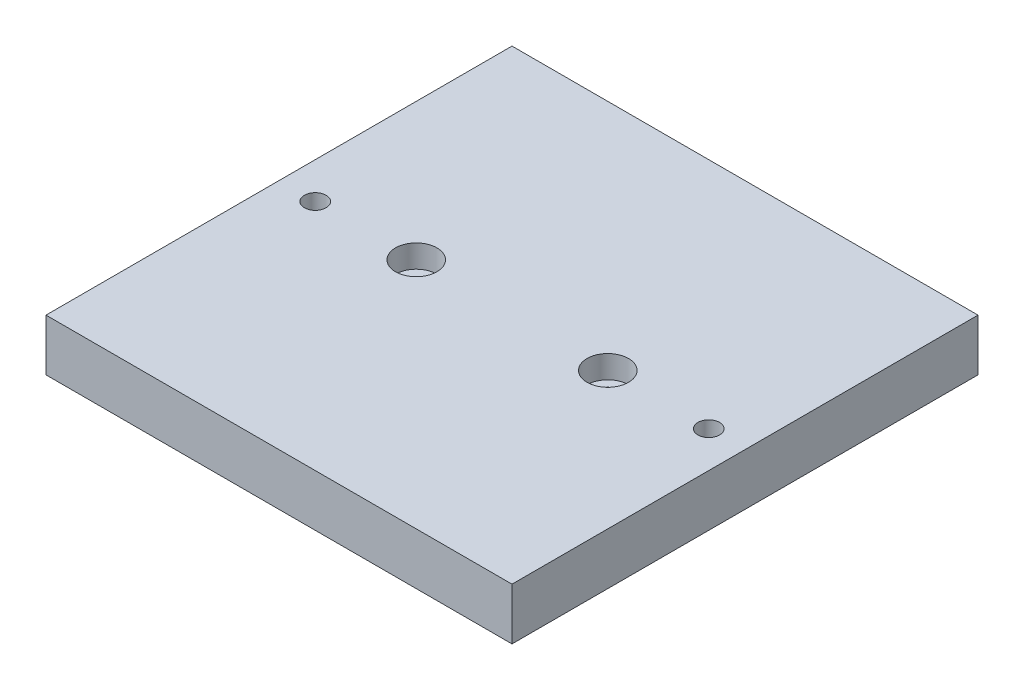
ISO-10303-21;
HEADER;
FILE_DESCRIPTION(('STEP AP214'),'2;1');
FILE_NAME('part.step','',(''),(''),'','','');
FILE_SCHEMA(('AUTOMOTIVE_DESIGN { 1 0 10303 214 1 1 1 1 }'));
ENDSEC;
DATA;
#1=APPLICATION_CONTEXT('core data for automotive mechanical design processes');
#2=APPLICATION_PROTOCOL_DEFINITION('international standard','automotive_design',2000,#1);
#3=PRODUCT_CONTEXT('',#1,'mechanical');
#4=PRODUCT('Part','Part','',(#3));
#5=PRODUCT_RELATED_PRODUCT_CATEGORY('part','',(#4));
#6=PRODUCT_DEFINITION_FORMATION('','',#4);
#7=PRODUCT_DEFINITION_CONTEXT('part definition',#1,'design');
#8=PRODUCT_DEFINITION('design','',#6,#7);
#9=PRODUCT_DEFINITION_SHAPE('','',#8);
#10=(LENGTH_UNIT() NAMED_UNIT(*) SI_UNIT(.MILLI.,.METRE.));
#11=(NAMED_UNIT(*) PLANE_ANGLE_UNIT() SI_UNIT($,.RADIAN.));
#12=(NAMED_UNIT(*) SI_UNIT($,.STERADIAN.) SOLID_ANGLE_UNIT());
#13=UNCERTAINTY_MEASURE_WITH_UNIT(LENGTH_MEASURE(1.E-05),#10,'distance_accuracy_value','');
#14=(GEOMETRIC_REPRESENTATION_CONTEXT(3) GLOBAL_UNCERTAINTY_ASSIGNED_CONTEXT((#13)) GLOBAL_UNIT_ASSIGNED_CONTEXT((#10,
#11,#12)) REPRESENTATION_CONTEXT('',''));
#15=CARTESIAN_POINT('',(0.,0.,0.));
#16=DIRECTION('',(0.,0.,1.));
#17=DIRECTION('',(1.,0.,0.));
#18=AXIS2_PLACEMENT_3D('',#15,#16,#17);
#19=CARTESIAN_POINT('',(-41.9601226993865,105.,8.14417177914111));
#20=DIRECTION('',(0.,-1.,0.));
#21=DIRECTION('',(0.,0.,-1.));
#22=AXIS2_PLACEMENT_3D('',#19,#20,#21);
#23=CYLINDRICAL_SURFACE('',#22,2.25);
#24=CARTESIAN_POINT('',(-41.9601226993865,0.,8.14417177914111));
#25=DIRECTION('',(0.,1.,0.));
#26=DIRECTION('',(0.,0.,1.));
#27=AXIS2_PLACEMENT_3D('',#24,#25,#26);
#28=CIRCLE('',#27,2.25);
#29=CARTESIAN_POINT('',(-41.9601226993865,0.,10.3941717791411));
#30=VERTEX_POINT('',#29);
#31=EDGE_CURVE('E119',#30,#30,#28,.F.);
#32=ORIENTED_EDGE('',*,*,#31,.T.);
#33=EDGE_LOOP('',(#32));
#34=FACE_BOUND('',#33,.T.);
#35=CARTESIAN_POINT('',(-41.9601226993865,5.6,8.14417177914111));
#36=DIRECTION('',(0.,1.,0.));
#37=DIRECTION('',(0.,0.,1.));
#38=AXIS2_PLACEMENT_3D('',#35,#36,#37);
#39=CIRCLE('',#38,2.25);
#40=CARTESIAN_POINT('',(-41.9601226993865,5.6,10.3941717791411));
#41=VERTEX_POINT('',#40);
#42=EDGE_CURVE('E136',#41,#41,#39,.T.);
#43=ORIENTED_EDGE('',*,*,#42,.T.);
#44=EDGE_LOOP('',(#43));
#45=FACE_BOUND('',#44,.T.);
#46=ADVANCED_FACE('F45',(#34,#45),#23,.F.);
#47=CARTESIAN_POINT('',(-78.9601226993865,105.,8.14417177914112));
#48=DIRECTION('',(0.,-1.,0.));
#49=DIRECTION('',(0.,0.,-1.));
#50=AXIS2_PLACEMENT_3D('',#47,#48,#49);
#51=CYLINDRICAL_SURFACE('',#50,2.25);
#52=CARTESIAN_POINT('',(-78.9601226993865,0.,8.14417177914112));
#53=DIRECTION('',(0.,1.,0.));
#54=DIRECTION('',(0.,0.,1.));
#55=AXIS2_PLACEMENT_3D('',#52,#53,#54);
#56=CIRCLE('',#55,2.25);
#57=CARTESIAN_POINT('',(-78.9601226993865,0.,10.3941717791411));
#58=VERTEX_POINT('',#57);
#59=EDGE_CURVE('E49',#58,#58,#56,.F.);
#60=ORIENTED_EDGE('',*,*,#59,.T.);
#61=EDGE_LOOP('',(#60));
#62=FACE_BOUND('',#61,.T.);
#63=CARTESIAN_POINT('',(-78.9601226993865,5.6,8.14417177914112));
#64=DIRECTION('',(0.,1.,0.));
#65=DIRECTION('',(0.,0.,1.));
#66=AXIS2_PLACEMENT_3D('',#63,#64,#65);
#67=CIRCLE('',#66,2.25);
#68=CARTESIAN_POINT('',(-78.9601226993865,5.6,10.3941717791411));
#69=VERTEX_POINT('',#68);
#70=EDGE_CURVE('E131',#69,#69,#67,.T.);
#71=ORIENTED_EDGE('',*,*,#70,.T.);
#72=EDGE_LOOP('',(#71));
#73=FACE_BOUND('',#72,.T.);
#74=ADVANCED_FACE('F167',(#62,#73),#51,.F.);
#75=CARTESIAN_POINT('',(-105.460122699386,10.,-36.8558282208589));
#76=DIRECTION('',(1.,0.,0.));
#77=DIRECTION('',(0.,0.,-1.));
#78=AXIS2_PLACEMENT_3D('',#75,#76,#77);
#79=PLANE('',#78);
#80=DIRECTION('',(0.,0.,1.));
#81=VECTOR('',#80,1.);
#82=CARTESIAN_POINT('',(-105.460122699386,0.,-36.8558282208589));
#83=LINE('',#82,#81);
#84=CARTESIAN_POINT('',(-105.460122699386,0.,-36.8558282208589));
#85=VERTEX_POINT('',#84);
#86=CARTESIAN_POINT('',(-105.460122699386,0.,53.1441717791411));
#87=VERTEX_POINT('',#86);
#88=EDGE_CURVE('E112',#85,#87,#83,.T.);
#89=ORIENTED_EDGE('',*,*,#88,.T.);
#90=DIRECTION('',(0.,-1.,0.));
#91=VECTOR('',#90,1.);
#92=CARTESIAN_POINT('',(-105.460122699386,10.,53.1441717791411));
#93=LINE('',#92,#91);
#94=CARTESIAN_POINT('',(-105.460122699386,10.,53.1441717791411));
#95=VERTEX_POINT('',#94);
#96=EDGE_CURVE('E11',#95,#87,#93,.T.);
#97=ORIENTED_EDGE('',*,*,#96,.F.);
#98=DIRECTION('',(0.,0.,1.));
#99=VECTOR('',#98,1.);
#100=CARTESIAN_POINT('',(-105.460122699386,10.,-36.8558282208589));
#101=LINE('',#100,#99);
#102=CARTESIAN_POINT('',(-105.460122699386,10.,-36.8558282208589));
#103=VERTEX_POINT('',#102);
#104=EDGE_CURVE('E99',#103,#95,#101,.T.);
#105=ORIENTED_EDGE('',*,*,#104,.F.);
#106=DIRECTION('',(0.,-1.,0.));
#107=VECTOR('',#106,1.);
#108=CARTESIAN_POINT('',(-105.460122699386,10.,-36.8558282208589));
#109=LINE('',#108,#107);
#110=EDGE_CURVE('E108',#103,#85,#109,.T.);
#111=ORIENTED_EDGE('',*,*,#110,.T.);
#112=EDGE_LOOP('',(#89,#97,#105,#111));
#113=FACE_BOUND('',#112,.T.);
#114=ADVANCED_FACE('F47',(#113),#79,.F.);
#115=CARTESIAN_POINT('',(-105.460122699386,10.,53.1441717791411));
#116=DIRECTION('',(0.,0.,-1.));
#117=DIRECTION('',(-1.,0.,0.));
#118=AXIS2_PLACEMENT_3D('',#115,#116,#117);
#119=PLANE('',#118);
#120=DIRECTION('',(1.,0.,0.));
#121=VECTOR('',#120,1.);
#122=CARTESIAN_POINT('',(-105.460122699386,0.,53.1441717791411));
#123=LINE('',#122,#121);
#124=CARTESIAN_POINT('',(-15.4601226993865,0.,53.1441717791411));
#125=VERTEX_POINT('',#124);
#126=EDGE_CURVE('E103',#87,#125,#123,.T.);
#127=ORIENTED_EDGE('',*,*,#126,.T.);
#128=DIRECTION('',(0.,-1.,0.));
#129=VECTOR('',#128,1.);
#130=CARTESIAN_POINT('',(-15.4601226993865,10.,53.1441717791411));
#131=LINE('',#130,#129);
#132=CARTESIAN_POINT('',(-15.4601226993865,10.,53.1441717791411));
#133=VERTEX_POINT('',#132);
#134=EDGE_CURVE('E55',#133,#125,#131,.T.);
#135=ORIENTED_EDGE('',*,*,#134,.F.);
#136=DIRECTION('',(1.,0.,0.));
#137=VECTOR('',#136,1.);
#138=CARTESIAN_POINT('',(-105.460122699386,10.,53.1441717791411));
#139=LINE('',#138,#137);
#140=EDGE_CURVE('E94',#95,#133,#139,.T.);
#141=ORIENTED_EDGE('',*,*,#140,.F.);
#142=ORIENTED_EDGE('',*,*,#96,.T.);
#143=EDGE_LOOP('',(#127,#135,#141,#142));
#144=FACE_BOUND('',#143,.T.);
#145=ADVANCED_FACE('F102',(#144),#119,.F.);
#146=CARTESIAN_POINT('',(-15.4601226993865,10.,-36.8558282208589));
#147=DIRECTION('',(-1.,0.,0.));
#148=DIRECTION('',(0.,0.,1.));
#149=AXIS2_PLACEMENT_3D('',#146,#147,#148);
#150=PLANE('',#149);
#151=DIRECTION('',(0.,0.,-1.));
#152=VECTOR('',#151,1.);
#153=CARTESIAN_POINT('',(-15.4601226993865,0.,-36.8558282208589));
#154=LINE('',#153,#152);
#155=CARTESIAN_POINT('',(-15.4601226993865,0.,-36.8558282208589));
#156=VERTEX_POINT('',#155);
#157=EDGE_CURVE('E81',#125,#156,#154,.T.);
#158=ORIENTED_EDGE('',*,*,#157,.T.);
#159=DIRECTION('',(0.,-1.,0.));
#160=VECTOR('',#159,1.);
#161=CARTESIAN_POINT('',(-15.4601226993865,10.,-36.8558282208589));
#162=LINE('',#161,#160);
#163=CARTESIAN_POINT('',(-15.4601226993865,10.,-36.8558282208589));
#164=VERTEX_POINT('',#163);
#165=EDGE_CURVE('E104',#164,#156,#162,.T.);
#166=ORIENTED_EDGE('',*,*,#165,.F.);
#167=DIRECTION('',(0.,0.,-1.));
#168=VECTOR('',#167,1.);
#169=CARTESIAN_POINT('',(-15.4601226993865,10.,-36.8558282208589));
#170=LINE('',#169,#168);
#171=EDGE_CURVE('E97',#133,#164,#170,.T.);
#172=ORIENTED_EDGE('',*,*,#171,.F.);
#173=ORIENTED_EDGE('',*,*,#134,.T.);
#174=EDGE_LOOP('',(#158,#166,#172,#173));
#175=FACE_BOUND('',#174,.T.);
#176=ADVANCED_FACE('F106',(#175),#150,.F.);
#177=CARTESIAN_POINT('',(-105.460122699386,10.,-36.8558282208589));
#178=DIRECTION('',(0.,0.,1.));
#179=DIRECTION('',(1.,0.,0.));
#180=AXIS2_PLACEMENT_3D('',#177,#178,#179);
#181=PLANE('',#180);
#182=DIRECTION('',(-1.,0.,0.));
#183=VECTOR('',#182,1.);
#184=CARTESIAN_POINT('',(-105.460122699386,0.,-36.8558282208589));
#185=LINE('',#184,#183);
#186=EDGE_CURVE('E87',#156,#85,#185,.T.);
#187=ORIENTED_EDGE('',*,*,#186,.T.);
#188=ORIENTED_EDGE('',*,*,#110,.F.);
#189=DIRECTION('',(-1.,0.,0.));
#190=VECTOR('',#189,1.);
#191=CARTESIAN_POINT('',(-105.460122699386,10.,-36.8558282208589));
#192=LINE('',#191,#190);
#193=EDGE_CURVE('E64',#164,#103,#192,.T.);
#194=ORIENTED_EDGE('',*,*,#193,.F.);
#195=ORIENTED_EDGE('',*,*,#165,.T.);
#196=EDGE_LOOP('',(#187,#188,#194,#195));
#197=FACE_BOUND('',#196,.T.);
#198=ADVANCED_FACE('F151',(#197),#181,.F.);
#199=CARTESIAN_POINT('',(0.,10.,0.));
#200=DIRECTION('',(0.,1.,0.));
#201=DIRECTION('',(0.,0.,1.));
#202=AXIS2_PLACEMENT_3D('',#199,#200,#201);
#203=PLANE('',#202);
#204=CARTESIAN_POINT('',(-98.4601226993865,10.,8.14417177914112));
#205=DIRECTION('',(0.,1.,0.));
#206=DIRECTION('',(0.,0.,1.));
#207=AXIS2_PLACEMENT_3D('',#204,#205,#206);
#208=CIRCLE('',#207,2.1);
#209=CARTESIAN_POINT('',(-98.4601226993865,10.,10.2441717791411));
#210=VERTEX_POINT('',#209);
#211=EDGE_CURVE('E202',#210,#210,#208,.T.);
#212=ORIENTED_EDGE('',*,*,#211,.F.);
#213=EDGE_LOOP('',(#212));
#214=FACE_BOUND('',#213,.T.);
#215=CARTESIAN_POINT('',(-22.4601226993865,10.,8.14417177914111));
#216=DIRECTION('',(0.,1.,0.));
#217=DIRECTION('',(0.,0.,1.));
#218=AXIS2_PLACEMENT_3D('',#215,#216,#217);
#219=CIRCLE('',#218,2.1);
#220=CARTESIAN_POINT('',(-22.4601226993865,10.,10.2441717791411));
#221=VERTEX_POINT('',#220);
#222=EDGE_CURVE('E204',#221,#221,#219,.T.);
#223=ORIENTED_EDGE('',*,*,#222,.F.);
#224=EDGE_LOOP('',(#223));
#225=FACE_BOUND('',#224,.T.);
#226=CARTESIAN_POINT('',(-78.9601226993865,10.,8.14417177914112));
#227=DIRECTION('',(0.,1.,0.));
#228=DIRECTION('',(0.,0.,1.));
#229=AXIS2_PLACEMENT_3D('',#226,#227,#228);
#230=CIRCLE('',#229,4.00000000000001);
#231=CARTESIAN_POINT('',(-78.9601226993865,10.,12.1441717791411));
#232=VERTEX_POINT('',#231);
#233=EDGE_CURVE('E126',#232,#232,#230,.T.);
#234=ORIENTED_EDGE('',*,*,#233,.F.);
#235=EDGE_LOOP('',(#234));
#236=FACE_BOUND('',#235,.T.);
#237=CARTESIAN_POINT('',(-41.9601226993865,10.,8.14417177914111));
#238=DIRECTION('',(0.,1.,0.));
#239=DIRECTION('',(0.,0.,1.));
#240=AXIS2_PLACEMENT_3D('',#237,#238,#239);
#241=CIRCLE('',#240,4.);
#242=CARTESIAN_POINT('',(-41.9601226993865,10.,12.1441717791411));
#243=VERTEX_POINT('',#242);
#244=EDGE_CURVE('E139',#243,#243,#241,.T.);
#245=ORIENTED_EDGE('',*,*,#244,.F.);
#246=EDGE_LOOP('',(#245));
#247=FACE_BOUND('',#246,.T.);
#248=ORIENTED_EDGE('',*,*,#104,.T.);
#249=ORIENTED_EDGE('',*,*,#140,.T.);
#250=ORIENTED_EDGE('',*,*,#171,.T.);
#251=ORIENTED_EDGE('',*,*,#193,.T.);
#252=EDGE_LOOP('',(#248,#249,#250,#251));
#253=FACE_BOUND('',#252,.T.);
#254=ADVANCED_FACE('F95',(#214,#225,#236,#247,#253),#203,.T.);
#255=CARTESIAN_POINT('',(0.,0.,0.));
#256=DIRECTION('',(0.,1.,0.));
#257=DIRECTION('',(0.,0.,1.));
#258=AXIS2_PLACEMENT_3D('',#255,#256,#257);
#259=PLANE('',#258);
#260=CARTESIAN_POINT('',(-98.4601226993865,0.,8.14417177914112));
#261=DIRECTION('',(0.,1.,0.));
#262=DIRECTION('',(0.,0.,1.));
#263=AXIS2_PLACEMENT_3D('',#260,#261,#262);
#264=CIRCLE('',#263,2.09999999999999);
#265=CARTESIAN_POINT('',(-98.4601226993865,0.,10.2441717791411));
#266=VERTEX_POINT('',#265);
#267=EDGE_CURVE('E200',#266,#266,#264,.T.);
#268=ORIENTED_EDGE('',*,*,#267,.T.);
#269=EDGE_LOOP('',(#268));
#270=FACE_BOUND('',#269,.T.);
#271=CARTESIAN_POINT('',(-22.4601226993865,0.,8.14417177914111));
#272=DIRECTION('',(0.,1.,0.));
#273=DIRECTION('',(0.,0.,1.));
#274=AXIS2_PLACEMENT_3D('',#271,#272,#273);
#275=CIRCLE('',#274,2.1);
#276=CARTESIAN_POINT('',(-22.4601226993865,0.,10.2441717791411));
#277=VERTEX_POINT('',#276);
#278=EDGE_CURVE('E140',#277,#277,#275,.T.);
#279=ORIENTED_EDGE('',*,*,#278,.T.);
#280=EDGE_LOOP('',(#279));
#281=FACE_BOUND('',#280,.T.);
#282=ORIENTED_EDGE('',*,*,#59,.F.);
#283=EDGE_LOOP('',(#282));
#284=FACE_BOUND('',#283,.T.);
#285=ORIENTED_EDGE('',*,*,#31,.F.);
#286=EDGE_LOOP('',(#285));
#287=FACE_BOUND('',#286,.T.);
#288=ORIENTED_EDGE('',*,*,#88,.F.);
#289=ORIENTED_EDGE('',*,*,#186,.F.);
#290=ORIENTED_EDGE('',*,*,#157,.F.);
#291=ORIENTED_EDGE('',*,*,#126,.F.);
#292=EDGE_LOOP('',(#288,#289,#290,#291));
#293=FACE_BOUND('',#292,.T.);
#294=ADVANCED_FACE('F150',(#270,#281,#284,#287,#293),#259,.F.);
#295=CARTESIAN_POINT('',(-78.9601226993865,5.6,8.14417177914112));
#296=DIRECTION('',(0.,1.,0.));
#297=DIRECTION('',(0.,0.,1.));
#298=AXIS2_PLACEMENT_3D('',#295,#296,#297);
#299=CYLINDRICAL_SURFACE('',#298,4.00000000000001);
#300=CARTESIAN_POINT('',(-78.9601226993865,5.6,8.14417177914112));
#301=DIRECTION('',(0.,1.,0.));
#302=DIRECTION('',(0.,0.,1.));
#303=AXIS2_PLACEMENT_3D('',#300,#301,#302);
#304=CIRCLE('',#303,4.00000000000001);
#305=CARTESIAN_POINT('',(-78.9601226993865,5.6,12.1441717791411));
#306=VERTEX_POINT('',#305);
#307=EDGE_CURVE('E121',#306,#306,#304,.T.);
#308=ORIENTED_EDGE('',*,*,#307,.F.);
#309=EDGE_LOOP('',(#308));
#310=FACE_BOUND('',#309,.T.);
#311=ORIENTED_EDGE('',*,*,#233,.T.);
#312=EDGE_LOOP('',(#311));
#313=FACE_BOUND('',#312,.T.);
#314=ADVANCED_FACE('F158',(#310,#313),#299,.F.);
#315=CARTESIAN_POINT('',(-78.9601226993865,5.6,8.14417177914112));
#316=DIRECTION('',(0.,1.,0.));
#317=DIRECTION('',(0.,0.,1.));
#318=AXIS2_PLACEMENT_3D('',#315,#316,#317);
#319=PLANE('',#318);
#320=ORIENTED_EDGE('',*,*,#70,.F.);
#321=EDGE_LOOP('',(#320));
#322=FACE_BOUND('',#321,.T.);
#323=ORIENTED_EDGE('',*,*,#307,.T.);
#324=EDGE_LOOP('',(#323));
#325=FACE_BOUND('',#324,.T.);
#326=ADVANCED_FACE('F178',(#322,#325),#319,.T.);
#327=CARTESIAN_POINT('',(-41.9601226993865,5.6,8.14417177914111));
#328=DIRECTION('',(0.,1.,0.));
#329=DIRECTION('',(0.,0.,1.));
#330=AXIS2_PLACEMENT_3D('',#327,#328,#329);
#331=CYLINDRICAL_SURFACE('',#330,4.);
#332=CARTESIAN_POINT('',(-41.9601226993865,5.6,8.14417177914111));
#333=DIRECTION('',(0.,1.,0.));
#334=DIRECTION('',(0.,0.,1.));
#335=AXIS2_PLACEMENT_3D('',#332,#333,#334);
#336=CIRCLE('',#335,4.);
#337=CARTESIAN_POINT('',(-41.9601226993865,5.6,12.1441717791411));
#338=VERTEX_POINT('',#337);
#339=EDGE_CURVE('E141',#338,#338,#336,.T.);
#340=ORIENTED_EDGE('',*,*,#339,.F.);
#341=EDGE_LOOP('',(#340));
#342=FACE_BOUND('',#341,.T.);
#343=ORIENTED_EDGE('',*,*,#244,.T.);
#344=EDGE_LOOP('',(#343));
#345=FACE_BOUND('',#344,.T.);
#346=ADVANCED_FACE('F147',(#342,#345),#331,.F.);
#347=CARTESIAN_POINT('',(-41.9601226993865,5.6,8.14417177914111));
#348=DIRECTION('',(0.,1.,0.));
#349=DIRECTION('',(0.,0.,1.));
#350=AXIS2_PLACEMENT_3D('',#347,#348,#349);
#351=PLANE('',#350);
#352=ORIENTED_EDGE('',*,*,#42,.F.);
#353=EDGE_LOOP('',(#352));
#354=FACE_BOUND('',#353,.T.);
#355=ORIENTED_EDGE('',*,*,#339,.T.);
#356=EDGE_LOOP('',(#355));
#357=FACE_BOUND('',#356,.T.);
#358=ADVANCED_FACE('F177',(#354,#357),#351,.T.);
#359=CARTESIAN_POINT('',(-22.4601226993865,10.,8.14417177914111));
#360=DIRECTION('',(0.,1.,0.));
#361=DIRECTION('',(0.,0.,1.));
#362=AXIS2_PLACEMENT_3D('',#359,#360,#361);
#363=CYLINDRICAL_SURFACE('',#362,2.1);
#364=ORIENTED_EDGE('',*,*,#278,.F.);
#365=EDGE_LOOP('',(#364));
#366=FACE_BOUND('',#365,.T.);
#367=ORIENTED_EDGE('',*,*,#222,.T.);
#368=EDGE_LOOP('',(#367));
#369=FACE_BOUND('',#368,.T.);
#370=ADVANCED_FACE('F182',(#366,#369),#363,.F.);
#371=CARTESIAN_POINT('',(-98.4601226993865,10.,8.14417177914112));
#372=DIRECTION('',(0.,1.,0.));
#373=DIRECTION('',(0.,0.,1.));
#374=AXIS2_PLACEMENT_3D('',#371,#372,#373);
#375=CYLINDRICAL_SURFACE('',#374,2.1);
#376=ORIENTED_EDGE('',*,*,#267,.F.);
#377=EDGE_LOOP('',(#376));
#378=FACE_BOUND('',#377,.T.);
#379=ORIENTED_EDGE('',*,*,#211,.T.);
#380=EDGE_LOOP('',(#379));
#381=FACE_BOUND('',#380,.T.);
#382=ADVANCED_FACE('F192',(#378,#381),#375,.F.);
#383=CLOSED_SHELL('',(#46,#74,#114,#145,#176,#198,#254,#294,#314,#326,#346,#358,#370,#382));
#384=MANIFOLD_SOLID_BREP('B2',#383);
#385=ADVANCED_BREP_SHAPE_REPRESENTATION('',(#18,#384),#14);
#386=SHAPE_DEFINITION_REPRESENTATION(#9,#385);
ENDSEC;
END-ISO-10303-21;
